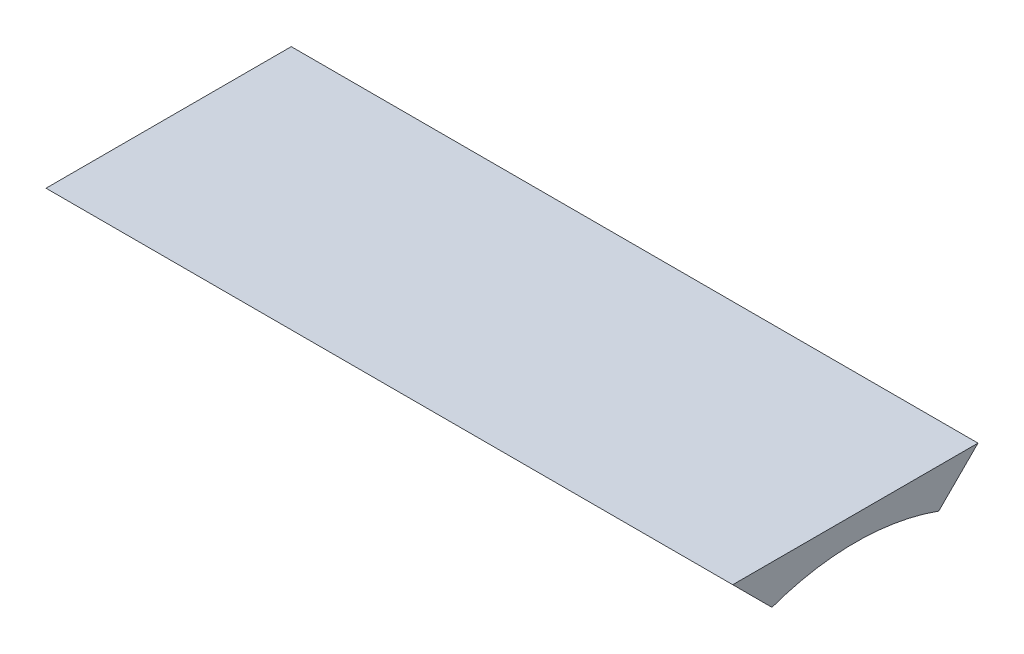
ISO-10303-21;
HEADER;
FILE_DESCRIPTION(('STEP AP214'),'2;1');
FILE_NAME('part.step','',(''),(''),'','','');
FILE_SCHEMA(('AUTOMOTIVE_DESIGN { 1 0 10303 214 1 1 1 1 }'));
ENDSEC;
DATA;
#1=APPLICATION_CONTEXT('core data for automotive mechanical design processes');
#2=APPLICATION_PROTOCOL_DEFINITION('international standard','automotive_design',2000,#1);
#3=PRODUCT_CONTEXT('',#1,'mechanical');
#4=PRODUCT('Part','Part','',(#3));
#5=PRODUCT_RELATED_PRODUCT_CATEGORY('part','',(#4));
#6=PRODUCT_DEFINITION_FORMATION('','',#4);
#7=PRODUCT_DEFINITION_CONTEXT('part definition',#1,'design');
#8=PRODUCT_DEFINITION('design','',#6,#7);
#9=PRODUCT_DEFINITION_SHAPE('','',#8);
#10=(LENGTH_UNIT() NAMED_UNIT(*) SI_UNIT(.MILLI.,.METRE.));
#11=(NAMED_UNIT(*) PLANE_ANGLE_UNIT() SI_UNIT($,.RADIAN.));
#12=(NAMED_UNIT(*) SI_UNIT($,.STERADIAN.) SOLID_ANGLE_UNIT());
#13=UNCERTAINTY_MEASURE_WITH_UNIT(LENGTH_MEASURE(1.E-05),#10,'distance_accuracy_value','');
#14=(GEOMETRIC_REPRESENTATION_CONTEXT(3) GLOBAL_UNCERTAINTY_ASSIGNED_CONTEXT((#13)) GLOBAL_UNIT_ASSIGNED_CONTEXT((#10,
#11,#12)) REPRESENTATION_CONTEXT('',''));
#15=CARTESIAN_POINT('',(0.,0.,0.));
#16=DIRECTION('',(0.,0.,1.));
#17=DIRECTION('',(1.,0.,0.));
#18=AXIS2_PLACEMENT_3D('',#15,#16,#17);
#19=CARTESIAN_POINT('',(70.,0.,0.));
#20=DIRECTION('',(-1.,0.,0.));
#21=DIRECTION('',(0.,0.,1.));
#22=AXIS2_PLACEMENT_3D('',#19,#20,#21);
#23=CYLINDRICAL_SURFACE('',#22,25.);
#24=CARTESIAN_POINT('',(0.,0.,0.));
#25=DIRECTION('',(1.,0.,0.));
#26=DIRECTION('',(0.,0.,-1.));
#27=AXIS2_PLACEMENT_3D('',#24,#25,#26);
#28=CIRCLE('',#27,25.);
#29=CARTESIAN_POINT('',(0.,23.5106358910175,-8.49999999999995));
#30=VERTEX_POINT('',#29);
#31=CARTESIAN_POINT('',(0.,23.5106358910175,8.49999999999996));
#32=VERTEX_POINT('',#31);
#33=EDGE_CURVE('E98',#30,#32,#28,.T.);
#34=ORIENTED_EDGE('',*,*,#33,.F.);
#35=DIRECTION('',(-1.,0.,0.));
#36=VECTOR('',#35,1.);
#37=CARTESIAN_POINT('',(70.,23.5106358910175,-8.49999999999995));
#38=LINE('',#37,#36);
#39=CARTESIAN_POINT('',(70.,23.5106358910175,-8.49999999999995));
#40=VERTEX_POINT('',#39);
#41=EDGE_CURVE('E11',#40,#30,#38,.T.);
#42=ORIENTED_EDGE('',*,*,#41,.F.);
#43=CARTESIAN_POINT('',(70.,0.,0.));
#44=DIRECTION('',(1.,0.,0.));
#45=DIRECTION('',(0.,0.,-1.));
#46=AXIS2_PLACEMENT_3D('',#43,#44,#45);
#47=CIRCLE('',#46,25.);
#48=CARTESIAN_POINT('',(70.,23.5106358910175,8.49999999999996));
#49=VERTEX_POINT('',#48);
#50=EDGE_CURVE('E90',#40,#49,#47,.T.);
#51=ORIENTED_EDGE('',*,*,#50,.T.);
#52=DIRECTION('',(-1.,0.,0.));
#53=VECTOR('',#52,1.);
#54=CARTESIAN_POINT('',(70.,23.5106358910175,8.49999999999996));
#55=LINE('',#54,#53);
#56=EDGE_CURVE('E51',#49,#32,#55,.T.);
#57=ORIENTED_EDGE('',*,*,#56,.T.);
#58=EDGE_LOOP('',(#34,#42,#51,#57));
#59=FACE_BOUND('',#58,.T.);
#60=ADVANCED_FACE('F35',(#59),#23,.F.);
#61=CARTESIAN_POINT('',(70.,7.50531794550896,7.50531794550885));
#62=DIRECTION('',(0.,-0.707106781186553,-0.707106781186542));
#63=DIRECTION('',(0.,0.707106781186542,-0.707106781186553));
#64=AXIS2_PLACEMENT_3D('',#61,#62,#63);
#65=PLANE('',#64);
#66=DIRECTION('',(0.,-0.707106781186542,0.707106781186553));
#67=VECTOR('',#66,1.);
#68=CARTESIAN_POINT('',(0.,7.50531794550896,7.50531794550885));
#69=LINE('',#68,#67);
#70=CARTESIAN_POINT('',(0.,27.5106358910175,-12.5));
#71=VERTEX_POINT('',#70);
#72=EDGE_CURVE('E81',#71,#30,#69,.T.);
#73=ORIENTED_EDGE('',*,*,#72,.F.);
#74=DIRECTION('',(-1.,0.,0.));
#75=VECTOR('',#74,1.);
#76=CARTESIAN_POINT('',(70.,27.5106358910175,-12.5));
#77=LINE('',#76,#75);
#78=CARTESIAN_POINT('',(70.,27.5106358910175,-12.5));
#79=VERTEX_POINT('',#78);
#80=EDGE_CURVE('E43',#79,#71,#77,.T.);
#81=ORIENTED_EDGE('',*,*,#80,.F.);
#82=DIRECTION('',(0.,-0.707106781186542,0.707106781186553));
#83=VECTOR('',#82,1.);
#84=CARTESIAN_POINT('',(70.,7.50531794550896,7.50531794550885));
#85=LINE('',#84,#83);
#86=EDGE_CURVE('E79',#79,#40,#85,.T.);
#87=ORIENTED_EDGE('',*,*,#86,.T.);
#88=ORIENTED_EDGE('',*,*,#41,.T.);
#89=EDGE_LOOP('',(#73,#81,#87,#88));
#90=FACE_BOUND('',#89,.T.);
#91=ADVANCED_FACE('F78',(#90),#65,.T.);
#92=CARTESIAN_POINT('',(70.,27.5106358910175,0.));
#93=DIRECTION('',(0.,1.,0.));
#94=DIRECTION('',(0.,0.,1.));
#95=AXIS2_PLACEMENT_3D('',#92,#93,#94);
#96=PLANE('',#95);
#97=DIRECTION('',(0.,0.,-1.));
#98=VECTOR('',#97,1.);
#99=CARTESIAN_POINT('',(0.,27.5106358910175,0.));
#100=LINE('',#99,#98);
#101=CARTESIAN_POINT('',(0.,27.5106358910175,12.5));
#102=VERTEX_POINT('',#101);
#103=EDGE_CURVE('E101',#102,#71,#100,.T.);
#104=ORIENTED_EDGE('',*,*,#103,.F.);
#105=DIRECTION('',(-1.,0.,0.));
#106=VECTOR('',#105,1.);
#107=CARTESIAN_POINT('',(70.,27.5106358910175,12.5));
#108=LINE('',#107,#106);
#109=CARTESIAN_POINT('',(70.,27.5106358910175,12.5));
#110=VERTEX_POINT('',#109);
#111=EDGE_CURVE('E64',#110,#102,#108,.T.);
#112=ORIENTED_EDGE('',*,*,#111,.F.);
#113=DIRECTION('',(0.,0.,-1.));
#114=VECTOR('',#113,1.);
#115=CARTESIAN_POINT('',(70.,27.5106358910175,0.));
#116=LINE('',#115,#114);
#117=EDGE_CURVE('E89',#110,#79,#116,.T.);
#118=ORIENTED_EDGE('',*,*,#117,.T.);
#119=ORIENTED_EDGE('',*,*,#80,.T.);
#120=EDGE_LOOP('',(#104,#112,#118,#119));
#121=FACE_BOUND('',#120,.T.);
#122=ADVANCED_FACE('F92',(#121),#96,.T.);
#123=CARTESIAN_POINT('',(70.,7.5053179455089,-7.50531794550882));
#124=DIRECTION('',(0.,-0.707106781186551,0.707106781186544));
#125=DIRECTION('',(0.,-0.707106781186544,-0.707106781186551));
#126=AXIS2_PLACEMENT_3D('',#123,#124,#125);
#127=PLANE('',#126);
#128=DIRECTION('',(0.,0.707106781186544,0.707106781186551));
#129=VECTOR('',#128,1.);
#130=CARTESIAN_POINT('',(0.,7.5053179455089,-7.50531794550882));
#131=LINE('',#130,#129);
#132=EDGE_CURVE('E103',#32,#102,#131,.T.);
#133=ORIENTED_EDGE('',*,*,#132,.F.);
#134=ORIENTED_EDGE('',*,*,#56,.F.);
#135=DIRECTION('',(0.,0.707106781186544,0.707106781186551));
#136=VECTOR('',#135,1.);
#137=CARTESIAN_POINT('',(70.,7.5053179455089,-7.50531794550882));
#138=LINE('',#137,#136);
#139=EDGE_CURVE('E93',#49,#110,#138,.T.);
#140=ORIENTED_EDGE('',*,*,#139,.T.);
#141=ORIENTED_EDGE('',*,*,#111,.T.);
#142=EDGE_LOOP('',(#133,#134,#140,#141));
#143=FACE_BOUND('',#142,.T.);
#144=ADVANCED_FACE('F108',(#143),#127,.T.);
#145=CARTESIAN_POINT('',(70.,0.,0.));
#146=DIRECTION('',(1.,0.,0.));
#147=DIRECTION('',(0.,0.,-1.));
#148=AXIS2_PLACEMENT_3D('',#145,#146,#147);
#149=PLANE('',#148);
#150=ORIENTED_EDGE('',*,*,#50,.F.);
#151=ORIENTED_EDGE('',*,*,#86,.F.);
#152=ORIENTED_EDGE('',*,*,#117,.F.);
#153=ORIENTED_EDGE('',*,*,#139,.F.);
#154=EDGE_LOOP('',(#150,#151,#152,#153));
#155=FACE_BOUND('',#154,.T.);
#156=ADVANCED_FACE('F87',(#155),#149,.T.);
#157=CARTESIAN_POINT('',(0.,0.,0.));
#158=DIRECTION('',(1.,0.,0.));
#159=DIRECTION('',(0.,0.,-1.));
#160=AXIS2_PLACEMENT_3D('',#157,#158,#159);
#161=PLANE('',#160);
#162=ORIENTED_EDGE('',*,*,#33,.T.);
#163=ORIENTED_EDGE('',*,*,#132,.T.);
#164=ORIENTED_EDGE('',*,*,#103,.T.);
#165=ORIENTED_EDGE('',*,*,#72,.T.);
#166=EDGE_LOOP('',(#162,#163,#164,#165));
#167=FACE_BOUND('',#166,.T.);
#168=ADVANCED_FACE('F115',(#167),#161,.F.);
#169=CLOSED_SHELL('',(#60,#91,#122,#144,#156,#168));
#170=MANIFOLD_SOLID_BREP('B2',#169);
#171=ADVANCED_BREP_SHAPE_REPRESENTATION('',(#18,#170),#14);
#172=SHAPE_DEFINITION_REPRESENTATION(#9,#171);
ENDSEC;
END-ISO-10303-21;
